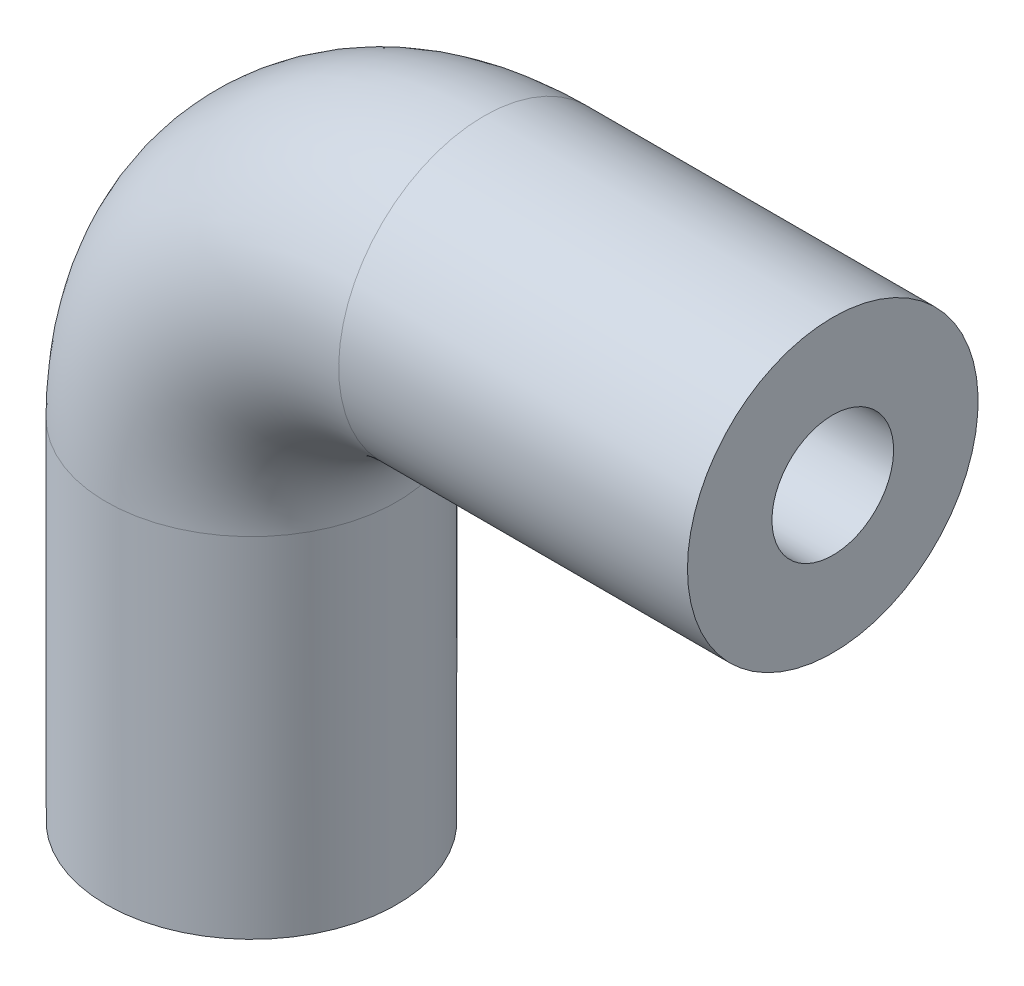
ISO-10303-21;
HEADER;
FILE_DESCRIPTION(('STEP AP214'),'2;1');
FILE_NAME('part.step','',(''),(''),'','','');
FILE_SCHEMA(('AUTOMOTIVE_DESIGN { 1 0 10303 214 1 1 1 1 }'));
ENDSEC;
DATA;
#1=APPLICATION_CONTEXT('core data for automotive mechanical design processes');
#2=APPLICATION_PROTOCOL_DEFINITION('international standard','automotive_design',2000,#1);
#3=PRODUCT_CONTEXT('',#1,'mechanical');
#4=PRODUCT('Part','Part','',(#3));
#5=PRODUCT_RELATED_PRODUCT_CATEGORY('part','',(#4));
#6=PRODUCT_DEFINITION_FORMATION('','',#4);
#7=PRODUCT_DEFINITION_CONTEXT('part definition',#1,'design');
#8=PRODUCT_DEFINITION('design','',#6,#7);
#9=PRODUCT_DEFINITION_SHAPE('','',#8);
#10=(LENGTH_UNIT() NAMED_UNIT(*) SI_UNIT(.MILLI.,.METRE.));
#11=(NAMED_UNIT(*) PLANE_ANGLE_UNIT() SI_UNIT($,.RADIAN.));
#12=(NAMED_UNIT(*) SI_UNIT($,.STERADIAN.) SOLID_ANGLE_UNIT());
#13=UNCERTAINTY_MEASURE_WITH_UNIT(LENGTH_MEASURE(1.E-05),#10,'distance_accuracy_value','');
#14=(GEOMETRIC_REPRESENTATION_CONTEXT(3) GLOBAL_UNCERTAINTY_ASSIGNED_CONTEXT((#13)) GLOBAL_UNIT_ASSIGNED_CONTEXT((#10,
#11,#12)) REPRESENTATION_CONTEXT('',''));
#15=CARTESIAN_POINT('',(0.,0.,0.));
#16=DIRECTION('',(0.,0.,1.));
#17=DIRECTION('',(1.,0.,0.));
#18=AXIS2_PLACEMENT_3D('',#15,#16,#17);
#19=CARTESIAN_POINT('',(8.,20.,0.));
#20=DIRECTION('',(1.,0.,0.));
#21=DIRECTION('',(0.,0.,-1.));
#22=AXIS2_PLACEMENT_3D('',#19,#20,#21);
#23=CYLINDRICAL_SURFACE('',#22,5.);
#24=CARTESIAN_POINT('',(8.,20.,0.));
#25=DIRECTION('',(1.,0.,0.));
#26=DIRECTION('',(0.,0.,1.));
#27=AXIS2_PLACEMENT_3D('',#24,#25,#26);
#28=CIRCLE('',#27,5.);
#29=CARTESIAN_POINT('',(8.,25.,0.));
#30=VERTEX_POINT('',#29);
#31=EDGE_CURVE('E40',#30,#30,#28,.T.);
#32=ORIENTED_EDGE('',*,*,#31,.T.);
#33=EDGE_LOOP('',(#32));
#34=FACE_BOUND('',#33,.T.);
#35=CARTESIAN_POINT('',(20.,20.,0.));
#36=DIRECTION('',(1.,0.,0.));
#37=DIRECTION('',(0.,0.,1.));
#38=AXIS2_PLACEMENT_3D('',#35,#36,#37);
#39=CIRCLE('',#38,5.);
#40=CARTESIAN_POINT('',(20.,20.,5.));
#41=VERTEX_POINT('',#40);
#42=EDGE_CURVE('E10',#41,#41,#39,.T.);
#43=ORIENTED_EDGE('',*,*,#42,.F.);
#44=EDGE_LOOP('',(#43));
#45=FACE_BOUND('',#44,.T.);
#46=ADVANCED_FACE('F30',(#34,#45),#23,.T.);
#47=CARTESIAN_POINT('',(8.,20.,0.));
#48=DIRECTION('',(1.,0.,0.));
#49=DIRECTION('',(0.,0.,-1.));
#50=AXIS2_PLACEMENT_3D('',#47,#48,#49);
#51=CYLINDRICAL_SURFACE('',#50,2.09270875274629);
#52=CARTESIAN_POINT('',(8.,20.,0.));
#53=DIRECTION('',(1.,0.,0.));
#54=DIRECTION('',(0.,0.,1.));
#55=AXIS2_PLACEMENT_3D('',#52,#53,#54);
#56=CIRCLE('',#55,2.09270875274629);
#57=CARTESIAN_POINT('',(8.,22.0927087527463,0.));
#58=VERTEX_POINT('',#57);
#59=EDGE_CURVE('E44',#58,#58,#56,.T.);
#60=ORIENTED_EDGE('',*,*,#59,.F.);
#61=EDGE_LOOP('',(#60));
#62=FACE_BOUND('',#61,.T.);
#63=CARTESIAN_POINT('',(20.,20.,0.));
#64=DIRECTION('',(1.,0.,0.));
#65=DIRECTION('',(0.,0.,1.));
#66=AXIS2_PLACEMENT_3D('',#63,#64,#65);
#67=CIRCLE('',#66,2.09270875274629);
#68=CARTESIAN_POINT('',(20.,20.,2.09270875274629));
#69=VERTEX_POINT('',#68);
#70=EDGE_CURVE('E36',#69,#69,#67,.T.);
#71=ORIENTED_EDGE('',*,*,#70,.T.);
#72=EDGE_LOOP('',(#71));
#73=FACE_BOUND('',#72,.T.);
#74=ADVANCED_FACE('F72',(#62,#73),#51,.F.);
#75=CARTESIAN_POINT('',(8.,12.,0.));
#76=DIRECTION('',(0.,0.,-1.));
#77=DIRECTION('',(-1.,0.,0.));
#78=AXIS2_PLACEMENT_3D('',#75,#76,#77);
#79=TOROIDAL_SURFACE('',#78,8.,5.);
#80=CARTESIAN_POINT('',(0.,12.,0.));
#81=DIRECTION('',(0.,1.,0.));
#82=DIRECTION('',(0.,0.,1.));
#83=AXIS2_PLACEMENT_3D('',#80,#81,#82);
#84=CIRCLE('',#83,5.);
#85=CARTESIAN_POINT('',(-5.,12.,0.));
#86=VERTEX_POINT('',#85);
#87=EDGE_CURVE('E49',#86,#86,#84,.T.);
#88=CARTESIAN_POINT('',(8.,12.,0.));
#89=DIRECTION('',(0.,0.,-1.));
#90=DIRECTION('',(-1.,0.,0.));
#91=AXIS2_PLACEMENT_3D('',#88,#89,#90);
#92=CIRCLE('',#91,13.);
#93=EDGE_CURVE('',#86,#30,#92,.T.);
#94=ORIENTED_EDGE('',*,*,#87,.T.);
#95=ORIENTED_EDGE('',*,*,#31,.F.);
#96=ORIENTED_EDGE('',*,*,#93,.T.);
#97=ORIENTED_EDGE('',*,*,#93,.F.);
#98=EDGE_LOOP('',(#94,#96,#95,#97));
#99=FACE_BOUND('',#98,.T.);
#100=ADVANCED_FACE('F68',(#99),#79,.T.);
#101=CARTESIAN_POINT('',(8.,12.,0.));
#102=DIRECTION('',(0.,0.,-1.));
#103=DIRECTION('',(-1.,0.,0.));
#104=AXIS2_PLACEMENT_3D('',#101,#102,#103);
#105=TOROIDAL_SURFACE('',#104,8.,2.09270875274629);
#106=CARTESIAN_POINT('',(0.,12.,0.));
#107=DIRECTION('',(0.,1.,0.));
#108=DIRECTION('',(0.,0.,1.));
#109=AXIS2_PLACEMENT_3D('',#106,#107,#108);
#110=CIRCLE('',#109,2.09270875274629);
#111=CARTESIAN_POINT('',(-2.09270875274629,12.,0.));
#112=VERTEX_POINT('',#111);
#113=EDGE_CURVE('E53',#112,#112,#110,.T.);
#114=CARTESIAN_POINT('',(8.,12.,0.));
#115=DIRECTION('',(0.,0.,-1.));
#116=DIRECTION('',(-1.,0.,0.));
#117=AXIS2_PLACEMENT_3D('',#114,#115,#116);
#118=CIRCLE('',#117,10.0927087527463);
#119=EDGE_CURVE('',#112,#58,#118,.T.);
#120=ORIENTED_EDGE('',*,*,#113,.F.);
#121=ORIENTED_EDGE('',*,*,#59,.T.);
#122=ORIENTED_EDGE('',*,*,#119,.T.);
#123=ORIENTED_EDGE('',*,*,#119,.F.);
#124=EDGE_LOOP('',(#120,#122,#121,#123));
#125=FACE_BOUND('',#124,.T.);
#126=ADVANCED_FACE('F65',(#125),#105,.F.);
#127=CARTESIAN_POINT('',(0.,12.,0.));
#128=DIRECTION('',(0.,-1.,0.));
#129=DIRECTION('',(0.,0.,-1.));
#130=AXIS2_PLACEMENT_3D('',#127,#128,#129);
#131=CYLINDRICAL_SURFACE('',#130,2.09270875274629);
#132=ORIENTED_EDGE('',*,*,#113,.T.);
#133=EDGE_LOOP('',(#132));
#134=FACE_BOUND('',#133,.T.);
#135=CARTESIAN_POINT('',(0.,0.,0.));
#136=DIRECTION('',(0.,1.,0.));
#137=DIRECTION('',(0.,0.,1.));
#138=AXIS2_PLACEMENT_3D('',#135,#136,#137);
#139=CIRCLE('',#138,2.09270875274629);
#140=CARTESIAN_POINT('',(0.,0.,2.09270875274629));
#141=VERTEX_POINT('',#140);
#142=EDGE_CURVE('E54',#141,#141,#139,.T.);
#143=ORIENTED_EDGE('',*,*,#142,.F.);
#144=EDGE_LOOP('',(#143));
#145=FACE_BOUND('',#144,.T.);
#146=ADVANCED_FACE('F62',(#134,#145),#131,.F.);
#147=CARTESIAN_POINT('',(0.,12.,0.));
#148=DIRECTION('',(0.,-1.,0.));
#149=DIRECTION('',(0.,0.,-1.));
#150=AXIS2_PLACEMENT_3D('',#147,#148,#149);
#151=CYLINDRICAL_SURFACE('',#150,5.);
#152=ORIENTED_EDGE('',*,*,#87,.F.);
#153=EDGE_LOOP('',(#152));
#154=FACE_BOUND('',#153,.T.);
#155=CARTESIAN_POINT('',(0.,0.,0.));
#156=DIRECTION('',(0.,1.,0.));
#157=DIRECTION('',(0.,0.,1.));
#158=AXIS2_PLACEMENT_3D('',#155,#156,#157);
#159=CIRCLE('',#158,5.);
#160=CARTESIAN_POINT('',(0.,0.,5.));
#161=VERTEX_POINT('',#160);
#162=EDGE_CURVE('E50',#161,#161,#159,.T.);
#163=ORIENTED_EDGE('',*,*,#162,.T.);
#164=EDGE_LOOP('',(#163));
#165=FACE_BOUND('',#164,.T.);
#166=ADVANCED_FACE('F84',(#154,#165),#151,.T.);
#167=CARTESIAN_POINT('',(20.,20.,0.));
#168=DIRECTION('',(1.,0.,0.));
#169=DIRECTION('',(0.,0.,1.));
#170=AXIS2_PLACEMENT_3D('',#167,#168,#169);
#171=PLANE('',#170);
#172=ORIENTED_EDGE('',*,*,#70,.F.);
#173=EDGE_LOOP('',(#172));
#174=FACE_BOUND('',#173,.T.);
#175=ORIENTED_EDGE('',*,*,#42,.T.);
#176=EDGE_LOOP('',(#175));
#177=FACE_BOUND('',#176,.T.);
#178=ADVANCED_FACE('F87',(#174,#177),#171,.T.);
#179=CARTESIAN_POINT('',(0.,0.,0.));
#180=DIRECTION('',(0.,1.,0.));
#181=DIRECTION('',(0.,0.,1.));
#182=AXIS2_PLACEMENT_3D('',#179,#180,#181);
#183=PLANE('',#182);
#184=ORIENTED_EDGE('',*,*,#142,.T.);
#185=EDGE_LOOP('',(#184));
#186=FACE_BOUND('',#185,.T.);
#187=ORIENTED_EDGE('',*,*,#162,.F.);
#188=EDGE_LOOP('',(#187));
#189=FACE_BOUND('',#188,.T.);
#190=ADVANCED_FACE('F89',(#186,#189),#183,.F.);
#191=CLOSED_SHELL('',(#46,#74,#100,#126,#146,#166,#178,#190));
#192=MANIFOLD_SOLID_BREP('B2',#191);
#193=ADVANCED_BREP_SHAPE_REPRESENTATION('',(#18,#192),#14);
#194=SHAPE_DEFINITION_REPRESENTATION(#9,#193);
ENDSEC;
END-ISO-10303-21;
